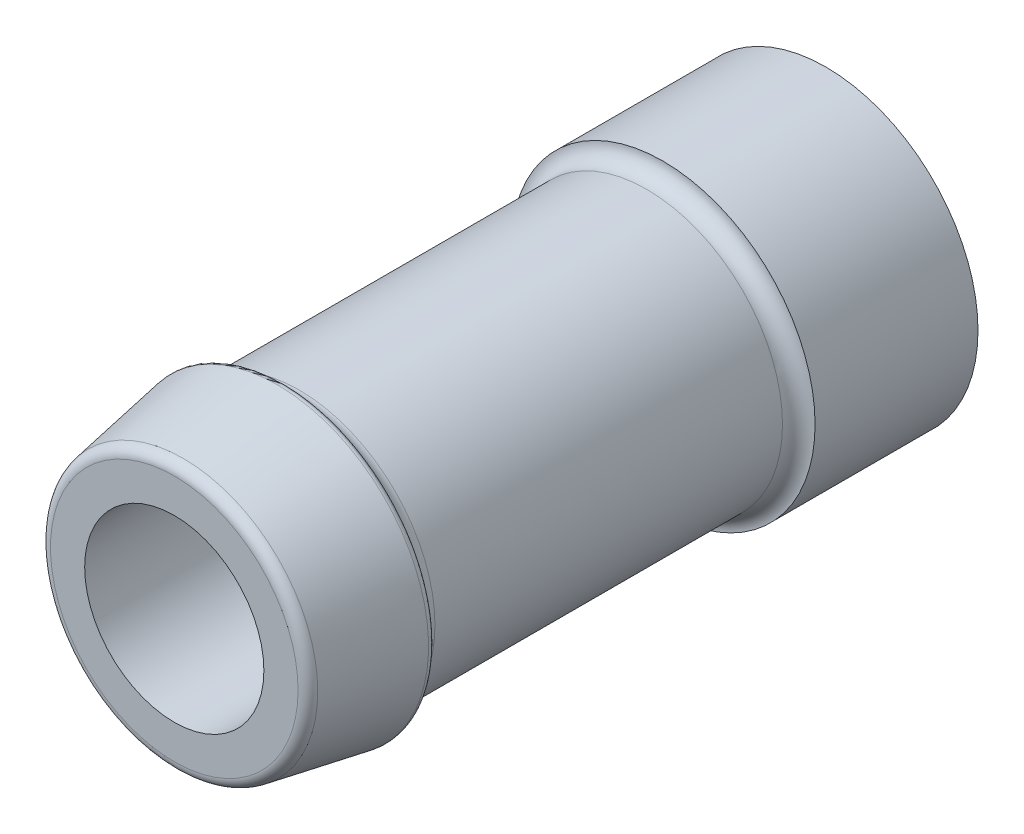
ISO-10303-21;
HEADER;
FILE_DESCRIPTION(('STEP AP214'),'2;1');
FILE_NAME('part.step','',(''),(''),'','','');
FILE_SCHEMA(('AUTOMOTIVE_DESIGN { 1 0 10303 214 1 1 1 1 }'));
ENDSEC;
DATA;
#1=APPLICATION_CONTEXT('core data for automotive mechanical design processes');
#2=APPLICATION_PROTOCOL_DEFINITION('international standard','automotive_design',2000,#1);
#3=PRODUCT_CONTEXT('',#1,'mechanical');
#4=PRODUCT('Part','Part','',(#3));
#5=PRODUCT_RELATED_PRODUCT_CATEGORY('part','',(#4));
#6=PRODUCT_DEFINITION_FORMATION('','',#4);
#7=PRODUCT_DEFINITION_CONTEXT('part definition',#1,'design');
#8=PRODUCT_DEFINITION('design','',#6,#7);
#9=PRODUCT_DEFINITION_SHAPE('','',#8);
#10=(LENGTH_UNIT() NAMED_UNIT(*) SI_UNIT(.MILLI.,.METRE.));
#11=(NAMED_UNIT(*) PLANE_ANGLE_UNIT() SI_UNIT($,.RADIAN.));
#12=(NAMED_UNIT(*) SI_UNIT($,.STERADIAN.) SOLID_ANGLE_UNIT());
#13=UNCERTAINTY_MEASURE_WITH_UNIT(LENGTH_MEASURE(1.E-05),#10,'distance_accuracy_value','');
#14=(GEOMETRIC_REPRESENTATION_CONTEXT(3) GLOBAL_UNCERTAINTY_ASSIGNED_CONTEXT((#13)) GLOBAL_UNIT_ASSIGNED_CONTEXT((#10,
#11,#12)) REPRESENTATION_CONTEXT('',''));
#15=CARTESIAN_POINT('',(0.,0.,0.));
#16=DIRECTION('',(0.,0.,1.));
#17=DIRECTION('',(1.,0.,0.));
#18=AXIS2_PLACEMENT_3D('',#15,#16,#17);
#19=CARTESIAN_POINT('',(0.,0.,30.48));
#20=DIRECTION('',(0.,0.,-1.));
#21=DIRECTION('',(-1.,0.,0.));
#22=AXIS2_PLACEMENT_3D('',#19,#20,#21);
#23=CYLINDRICAL_SURFACE('',#22,7.112);
#24=CARTESIAN_POINT('',(0.,0.,0.));
#25=DIRECTION('',(0.,0.,1.));
#26=DIRECTION('',(1.,0.,0.));
#27=AXIS2_PLACEMENT_3D('',#24,#25,#26);
#28=CIRCLE('',#27,7.112);
#29=CARTESIAN_POINT('',(-7.112,0.,0.));
#30=VERTEX_POINT('',#29);
#31=EDGE_CURVE('E71',#30,#30,#28,.T.);
#32=CARTESIAN_POINT('',(0.,0.,7.62));
#33=DIRECTION('',(0.,0.,1.));
#34=DIRECTION('',(1.,0.,0.));
#35=AXIS2_PLACEMENT_3D('',#32,#33,#34);
#36=CIRCLE('',#35,7.112);
#37=CARTESIAN_POINT('',(-7.112,0.,7.61999999999999));
#38=VERTEX_POINT('',#37);
#39=EDGE_CURVE('E72',#38,#38,#36,.T.);
#40=CARTESIAN_POINT('',(-7.112,0.,0.));
#41=CARTESIAN_POINT('',(-7.112,0.,0.0793749999999997));
#42=CARTESIAN_POINT('',(-7.112,0.,0.158749999999999));
#43=CARTESIAN_POINT('',(-7.112,0.,0.3175));
#44=CARTESIAN_POINT('',(-7.112,0.,0.396875));
#45=CARTESIAN_POINT('',(-7.112,0.,0.555625000000001));
#46=CARTESIAN_POINT('',(-7.112,0.,0.635));
#47=CARTESIAN_POINT('',(-7.112,0.,0.793749999999999));
#48=CARTESIAN_POINT('',(-7.112,0.,0.873124999999999));
#49=CARTESIAN_POINT('',(-7.112,0.,1.031875));
#50=CARTESIAN_POINT('',(-7.112,0.,1.11125));
#51=CARTESIAN_POINT('',(-7.112,0.,1.27));
#52=CARTESIAN_POINT('',(-7.112,0.,1.349375));
#53=CARTESIAN_POINT('',(-7.112,0.,1.508125));
#54=CARTESIAN_POINT('',(-7.112,0.,1.5875));
#55=CARTESIAN_POINT('',(-7.112,0.,1.74625));
#56=CARTESIAN_POINT('',(-7.112,0.,1.825625));
#57=CARTESIAN_POINT('',(-7.112,0.,1.984375));
#58=CARTESIAN_POINT('',(-7.112,0.,2.06375));
#59=CARTESIAN_POINT('',(-7.112,0.,2.2225));
#60=CARTESIAN_POINT('',(-7.112,0.,2.301875));
#61=CARTESIAN_POINT('',(-7.112,0.,2.460625));
#62=CARTESIAN_POINT('',(-7.112,0.,2.54));
#63=CARTESIAN_POINT('',(-7.112,0.,2.69875));
#64=CARTESIAN_POINT('',(-7.112,0.,2.778125));
#65=CARTESIAN_POINT('',(-7.112,0.,2.936875));
#66=CARTESIAN_POINT('',(-7.112,0.,3.01625));
#67=CARTESIAN_POINT('',(-7.112,0.,3.175));
#68=CARTESIAN_POINT('',(-7.112,0.,3.254375));
#69=CARTESIAN_POINT('',(-7.112,0.,3.413125));
#70=CARTESIAN_POINT('',(-7.112,0.,3.4925));
#71=CARTESIAN_POINT('',(-7.112,0.,3.65125));
#72=CARTESIAN_POINT('',(-7.112,0.,3.730625));
#73=CARTESIAN_POINT('',(-7.112,0.,3.889375));
#74=CARTESIAN_POINT('',(-7.112,0.,3.96875));
#75=CARTESIAN_POINT('',(-7.112,0.,4.1275));
#76=CARTESIAN_POINT('',(-7.112,0.,4.206875));
#77=CARTESIAN_POINT('',(-7.112,0.,4.365625));
#78=CARTESIAN_POINT('',(-7.112,0.,4.445));
#79=CARTESIAN_POINT('',(-7.112,0.,4.60375));
#80=CARTESIAN_POINT('',(-7.112,0.,4.683125));
#81=CARTESIAN_POINT('',(-7.112,0.,4.841875));
#82=CARTESIAN_POINT('',(-7.112,0.,4.92125));
#83=CARTESIAN_POINT('',(-7.112,0.,5.07999999999999));
#84=CARTESIAN_POINT('',(-7.112,0.,5.159375));
#85=CARTESIAN_POINT('',(-7.112,0.,5.318125));
#86=CARTESIAN_POINT('',(-7.112,0.,5.3975));
#87=CARTESIAN_POINT('',(-7.112,0.,5.55625));
#88=CARTESIAN_POINT('',(-7.112,0.,5.635625));
#89=CARTESIAN_POINT('',(-7.112,0.,5.794375));
#90=CARTESIAN_POINT('',(-7.112,0.,5.87375));
#91=CARTESIAN_POINT('',(-7.112,0.,6.0325));
#92=CARTESIAN_POINT('',(-7.112,0.,6.111875));
#93=CARTESIAN_POINT('',(-7.112,0.,6.27062499999999));
#94=CARTESIAN_POINT('',(-7.112,0.,6.34999999999999));
#95=CARTESIAN_POINT('',(-7.112,0.,6.50874999999999));
#96=CARTESIAN_POINT('',(-7.112,0.,6.588125));
#97=CARTESIAN_POINT('',(-7.112,0.,6.746875));
#98=CARTESIAN_POINT('',(-7.112,0.,6.82625));
#99=CARTESIAN_POINT('',(-7.112,0.,6.985));
#100=CARTESIAN_POINT('',(-7.112,0.,7.064375));
#101=CARTESIAN_POINT('',(-7.112,0.,7.223125));
#102=CARTESIAN_POINT('',(-7.112,0.,7.3025));
#103=CARTESIAN_POINT('',(-7.112,0.,7.46125));
#104=CARTESIAN_POINT('',(-7.112,0.,7.540625));
#105=CARTESIAN_POINT('',(-7.112,0.,7.61999999999999));
#106=B_SPLINE_CURVE_WITH_KNOTS('',3,(#40,#41,#42,#43,#44,#45,#46,#47,#48,#49,#50,#51,#52,#53,
#54,#55,#56,#57,#58,#59,#60,#61,#62,#63,#64,#65,#66,#67,#68,#69,#70,#71,#72,#73,#74,#75,#76,#77,
#78,#79,#80,#81,#82,#83,#84,#85,#86,#87,#88,#89,#90,#91,#92,#93,#94,#95,#96,#97,#98,#99,#100,
#101,#102,#103,#104,#105),.UNSPECIFIED.,.F.,.F.,(4,2,2,2,2,2,2,2,2,2,2,2,2,2,2,2,2,2,2,2,2,2,2,
2,2,2,2,2,2,2,2,2,4),(0.,0.238124999999999,0.476250000000001,0.714375,0.952499999999998,
1.190625,1.42875,1.666875,1.905,2.143125,2.38125,2.619375,2.8575,3.095625,3.33375,3.571875,3.81,
4.048125,4.28625,4.524375,4.7625,5.00062499999999,5.23875,5.476875,5.715,5.953125,6.19125,
6.42937499999999,6.6675,6.905625,7.14375,7.381875,7.61999999999999),.UNSPECIFIED.);
#107=EDGE_CURVE('BSEAM39',#30,#38,#106,.T.);
#108=ORIENTED_EDGE('',*,*,#31,.T.);
#109=ORIENTED_EDGE('',*,*,#39,.F.);
#110=ORIENTED_EDGE('',*,*,#107,.T.);
#111=ORIENTED_EDGE('',*,*,#107,.F.);
#112=EDGE_LOOP('',(#108,#110,#109,#111));
#113=FACE_BOUND('',#112,.T.);
#114=ADVANCED_FACE('F39',(#113),#23,.T.);
#115=CARTESIAN_POINT('',(0.,0.,30.48));
#116=DIRECTION('',(0.,0.,1.));
#117=DIRECTION('',(1.,0.,0.));
#118=AXIS2_PLACEMENT_3D('',#115,#116,#117);
#119=PLANE('',#118);
#120=CARTESIAN_POINT('',(0.,0.,30.48));
#121=DIRECTION('',(0.,0.,1.));
#122=DIRECTION('',(1.,0.,0.));
#123=AXIS2_PLACEMENT_3D('',#120,#121,#122);
#124=CIRCLE('',#123,5.78999632536298);
#125=CARTESIAN_POINT('',(5.78999632536298,0.,30.48));
#126=VERTEX_POINT('',#125);
#127=EDGE_CURVE('E57',#126,#126,#124,.T.);
#128=ORIENTED_EDGE('',*,*,#127,.T.);
#129=EDGE_LOOP('',(#128));
#130=FACE_BOUND('',#129,.T.);
#131=CARTESIAN_POINT('',(0.,0.,30.48));
#132=DIRECTION('',(0.,0.,1.));
#133=DIRECTION('',(1.,0.,0.));
#134=AXIS2_PLACEMENT_3D('',#131,#132,#133);
#135=CIRCLE('',#134,4.191);
#136=CARTESIAN_POINT('',(4.191,0.,30.48));
#137=VERTEX_POINT('',#136);
#138=EDGE_CURVE('E76',#137,#137,#135,.T.);
#139=ORIENTED_EDGE('',*,*,#138,.F.);
#140=EDGE_LOOP('',(#139));
#141=FACE_BOUND('',#140,.T.);
#142=ADVANCED_FACE('F98',(#130,#141),#119,.T.);
#143=CARTESIAN_POINT('',(0.,0.,0.));
#144=DIRECTION('',(0.,0.,1.));
#145=DIRECTION('',(1.,0.,0.));
#146=AXIS2_PLACEMENT_3D('',#143,#144,#145);
#147=PLANE('',#146);
#148=CARTESIAN_POINT('',(0.,0.,0.));
#149=DIRECTION('',(0.,0.,1.));
#150=DIRECTION('',(1.,0.,0.));
#151=AXIS2_PLACEMENT_3D('',#148,#149,#150);
#152=CIRCLE('',#151,4.191);
#153=CARTESIAN_POINT('',(4.191,0.,0.));
#154=VERTEX_POINT('',#153);
#155=EDGE_CURVE('E80',#154,#154,#152,.T.);
#156=ORIENTED_EDGE('',*,*,#155,.T.);
#157=EDGE_LOOP('',(#156));
#158=FACE_BOUND('',#157,.T.);
#159=ORIENTED_EDGE('',*,*,#31,.F.);
#160=EDGE_LOOP('',(#159));
#161=FACE_BOUND('',#160,.T.);
#162=ADVANCED_FACE('F88',(#158,#161),#147,.F.);
#163=CARTESIAN_POINT('',(0.,0.,0.));
#164=DIRECTION('',(0.,0.,1.));
#165=DIRECTION('',(1.,0.,0.));
#166=AXIS2_PLACEMENT_3D('',#163,#164,#165);
#167=CYLINDRICAL_SURFACE('',#166,4.191);
#168=CARTESIAN_POINT('',(4.191,0.,0.));
#169=CARTESIAN_POINT('',(4.191,0.,0.317499999999999));
#170=CARTESIAN_POINT('',(4.191,0.,0.635));
#171=CARTESIAN_POINT('',(4.191,0.,1.27));
#172=CARTESIAN_POINT('',(4.191,0.,1.5875));
#173=CARTESIAN_POINT('',(4.191,0.,2.2225));
#174=CARTESIAN_POINT('',(4.191,0.,2.54));
#175=CARTESIAN_POINT('',(4.191,0.,3.175));
#176=CARTESIAN_POINT('',(4.191,0.,3.4925));
#177=CARTESIAN_POINT('',(4.191,0.,4.1275));
#178=CARTESIAN_POINT('',(4.191,0.,4.445));
#179=CARTESIAN_POINT('',(4.191,0.,5.08));
#180=CARTESIAN_POINT('',(4.191,0.,5.3975));
#181=CARTESIAN_POINT('',(4.191,0.,6.0325));
#182=CARTESIAN_POINT('',(4.191,0.,6.35));
#183=CARTESIAN_POINT('',(4.191,0.,6.985));
#184=CARTESIAN_POINT('',(4.191,0.,7.3025));
#185=CARTESIAN_POINT('',(4.191,0.,7.9375));
#186=CARTESIAN_POINT('',(4.191,0.,8.255));
#187=CARTESIAN_POINT('',(4.191,0.,8.89));
#188=CARTESIAN_POINT('',(4.191,0.,9.2075));
#189=CARTESIAN_POINT('',(4.191,0.,9.8425));
#190=CARTESIAN_POINT('',(4.191,0.,10.16));
#191=CARTESIAN_POINT('',(4.191,0.,10.795));
#192=CARTESIAN_POINT('',(4.191,0.,11.1125));
#193=CARTESIAN_POINT('',(4.191,0.,11.7475));
#194=CARTESIAN_POINT('',(4.191,0.,12.065));
#195=CARTESIAN_POINT('',(4.191,0.,12.7));
#196=CARTESIAN_POINT('',(4.191,0.,13.0175));
#197=CARTESIAN_POINT('',(4.191,0.,13.6525));
#198=CARTESIAN_POINT('',(4.191,0.,13.97));
#199=CARTESIAN_POINT('',(4.191,0.,14.605));
#200=CARTESIAN_POINT('',(4.191,0.,14.9225));
#201=CARTESIAN_POINT('',(4.191,0.,15.5575));
#202=CARTESIAN_POINT('',(4.191,0.,15.875));
#203=CARTESIAN_POINT('',(4.191,0.,16.51));
#204=CARTESIAN_POINT('',(4.191,0.,16.8275));
#205=CARTESIAN_POINT('',(4.191,0.,17.4625));
#206=CARTESIAN_POINT('',(4.191,0.,17.78));
#207=CARTESIAN_POINT('',(4.191,0.,18.415));
#208=CARTESIAN_POINT('',(4.191,0.,18.7325));
#209=CARTESIAN_POINT('',(4.191,0.,19.3675));
#210=CARTESIAN_POINT('',(4.191,0.,19.685));
#211=CARTESIAN_POINT('',(4.191,0.,20.32));
#212=CARTESIAN_POINT('',(4.191,0.,20.6375));
#213=CARTESIAN_POINT('',(4.191,0.,21.2725));
#214=CARTESIAN_POINT('',(4.191,0.,21.59));
#215=CARTESIAN_POINT('',(4.191,0.,22.225));
#216=CARTESIAN_POINT('',(4.191,0.,22.5425));
#217=CARTESIAN_POINT('',(4.191,0.,23.1775));
#218=CARTESIAN_POINT('',(4.191,0.,23.495));
#219=CARTESIAN_POINT('',(4.191,0.,24.13));
#220=CARTESIAN_POINT('',(4.191,0.,24.4475));
#221=CARTESIAN_POINT('',(4.191,0.,25.0825));
#222=CARTESIAN_POINT('',(4.191,0.,25.4));
#223=CARTESIAN_POINT('',(4.191,0.,26.035));
#224=CARTESIAN_POINT('',(4.191,0.,26.3525));
#225=CARTESIAN_POINT('',(4.191,0.,26.9875));
#226=CARTESIAN_POINT('',(4.191,0.,27.305));
#227=CARTESIAN_POINT('',(4.191,0.,27.94));
#228=CARTESIAN_POINT('',(4.191,0.,28.2575));
#229=CARTESIAN_POINT('',(4.191,0.,28.8925));
#230=CARTESIAN_POINT('',(4.191,0.,29.21));
#231=CARTESIAN_POINT('',(4.191,0.,29.845));
#232=CARTESIAN_POINT('',(4.191,0.,30.1625));
#233=CARTESIAN_POINT('',(4.191,0.,30.48));
#234=B_SPLINE_CURVE_WITH_KNOTS('',3,(#168,#169,#170,#171,#172,#173,#174,#175,#176,#177,#178,
#179,#180,#181,#182,#183,#184,#185,#186,#187,#188,#189,#190,#191,#192,#193,#194,#195,#196,#197,
#198,#199,#200,#201,#202,#203,#204,#205,#206,#207,#208,#209,#210,#211,#212,#213,#214,#215,#216,
#217,#218,#219,#220,#221,#222,#223,#224,#225,#226,#227,#228,#229,#230,#231,#232,#233),
.UNSPECIFIED.,.F.,.F.,(4,2,2,2,2,2,2,2,2,2,2,2,2,2,2,2,2,2,2,2,2,2,2,2,2,2,2,2,2,2,2,2,4),(0.,
0.9525,1.905,2.8575,3.81,4.7625,5.715,6.6675,7.62,8.5725,9.525,10.4775,11.43,12.3825,13.335,
14.2875,15.24,16.1925,17.145,18.0975,19.05,20.0025,20.955,21.9075,22.86,23.8125,24.765,25.7175,
26.67,27.6225,28.575,29.5275,30.48),.UNSPECIFIED.);
#235=EDGE_CURVE('BSEAM91',#154,#137,#234,.T.);
#236=ORIENTED_EDGE('',*,*,#155,.F.);
#237=ORIENTED_EDGE('',*,*,#138,.T.);
#238=ORIENTED_EDGE('',*,*,#235,.T.);
#239=ORIENTED_EDGE('',*,*,#235,.F.);
#240=EDGE_LOOP('',(#236,#238,#237,#239));
#241=FACE_BOUND('',#240,.T.);
#242=ADVANCED_FACE('F91',(#241),#167,.F.);
#243=CARTESIAN_POINT('',(0.,0.,7.62));
#244=DIRECTION('',(0.,0.,1.));
#245=DIRECTION('',(1.,0.,0.));
#246=AXIS2_PLACEMENT_3D('',#243,#244,#245);
#247=CYLINDRICAL_SURFACE('',#246,6.35);
#248=CARTESIAN_POINT('',(0.,0.,24.638));
#249=DIRECTION('',(0.,0.,1.));
#250=DIRECTION('',(1.,0.,0.));
#251=AXIS2_PLACEMENT_3D('',#248,#249,#250);
#252=CIRCLE('',#251,6.35);
#253=CARTESIAN_POINT('',(6.35,0.,24.638));
#254=VERTEX_POINT('',#253);
#255=EDGE_CURVE('E63',#254,#254,#252,.F.);
#256=ORIENTED_EDGE('',*,*,#255,.T.);
#257=EDGE_LOOP('',(#256));
#258=FACE_BOUND('',#257,.T.);
#259=CARTESIAN_POINT('',(0.,0.,8.382));
#260=DIRECTION('',(0.,0.,1.));
#261=DIRECTION('',(1.,0.,0.));
#262=AXIS2_PLACEMENT_3D('',#259,#260,#261);
#263=CIRCLE('',#262,6.35);
#264=CARTESIAN_POINT('',(6.35,0.,8.382));
#265=VERTEX_POINT('',#264);
#266=EDGE_CURVE('E67',#265,#265,#263,.T.);
#267=ORIENTED_EDGE('',*,*,#266,.T.);
#268=EDGE_LOOP('',(#267));
#269=FACE_BOUND('',#268,.T.);
#270=ADVANCED_FACE('F94',(#258,#269),#247,.T.);
#271=CARTESIAN_POINT('',(0.,0.,8.382));
#272=DIRECTION('',(0.,0.,1.));
#273=DIRECTION('',(1.,0.,0.));
#274=AXIS2_PLACEMENT_3D('',#271,#272,#273);
#275=TOROIDAL_SURFACE('',#274,7.112,0.762);
#276=ORIENTED_EDGE('',*,*,#39,.T.);
#277=EDGE_LOOP('',(#276));
#278=FACE_BOUND('',#277,.T.);
#279=ORIENTED_EDGE('',*,*,#266,.F.);
#280=EDGE_LOOP('',(#279));
#281=FACE_BOUND('',#280,.T.);
#282=ADVANCED_FACE('F111',(#278,#281),#275,.F.);
#283=CARTESIAN_POINT('',(0.,0.,24.638));
#284=DIRECTION('',(0.,0.,1.));
#285=DIRECTION('',(1.,0.,0.));
#286=AXIS2_PLACEMENT_3D('',#283,#284,#285);
#287=TOROIDAL_SURFACE('',#286,7.112,0.762);
#288=CARTESIAN_POINT('',(0.,0.,25.3671751193928));
#289=DIRECTION('',(0.,0.,-1.));
#290=DIRECTION('',(-1.,0.,0.));
#291=AXIS2_PLACEMENT_3D('',#288,#289,#290);
#292=CIRCLE('',#291,6.89075885270041);
#293=CARTESIAN_POINT('',(-6.89075885270041,0.,25.3671751193928));
#294=VERTEX_POINT('',#293);
#295=EDGE_CURVE('E10',#294,#294,#292,.T.);
#296=ORIENTED_EDGE('',*,*,#295,.T.);
#297=EDGE_LOOP('',(#296));
#298=FACE_BOUND('',#297,.T.);
#299=ORIENTED_EDGE('',*,*,#255,.F.);
#300=EDGE_LOOP('',(#299));
#301=FACE_BOUND('',#300,.T.);
#302=ADVANCED_FACE('F114',(#298,#301),#287,.F.);
#303=CARTESIAN_POINT('',(0.,0.,30.48));
#304=DIRECTION('',(0.,0.,-1.));
#305=DIRECTION('',(-1.,0.,0.));
#306=AXIS2_PLACEMENT_3D('',#303,#304,#305);
#307=CONICAL_SURFACE('',#306,6.21625893800104,0.17453292519943);
#308=CARTESIAN_POINT('',(0.,0.,25.6543401296512));
#309=DIRECTION('',(0.,0.,-1.));
#310=DIRECTION('',(-1.,0.,0.));
#311=AXIS2_PLACEMENT_3D('',#308,#309,#310);
#312=CIRCLE('',#311,7.06715297286563);
#313=CARTESIAN_POINT('',(-7.06715297286563,0.,25.6543401296512));
#314=VERTEX_POINT('',#313);
#315=EDGE_CURVE('E47',#314,#314,#312,.F.);
#316=ORIENTED_EDGE('',*,*,#315,.T.);
#317=EDGE_LOOP('',(#316));
#318=FACE_BOUND('',#317,.T.);
#319=CARTESIAN_POINT('',(0.,0.,30.0602132742548));
#320=DIRECTION('',(0.,0.,1.));
#321=DIRECTION('',(1.,0.,0.));
#322=AXIS2_PLACEMENT_3D('',#319,#320,#321);
#323=CIRCLE('',#322,6.29027866389318);
#324=CARTESIAN_POINT('',(6.29027866389318,0.,30.0602132742548));
#325=VERTEX_POINT('',#324);
#326=EDGE_CURVE('E52',#325,#325,#323,.F.);
#327=ORIENTED_EDGE('',*,*,#326,.T.);
#328=EDGE_LOOP('',(#327));
#329=FACE_BOUND('',#328,.T.);
#330=ADVANCED_FACE('F118',(#318,#329),#307,.T.);
#331=CARTESIAN_POINT('',(0.,0.,29.972));
#332=DIRECTION('',(0.,0.,1.));
#333=DIRECTION('',(1.,0.,0.));
#334=AXIS2_PLACEMENT_3D('',#331,#332,#333);
#335=TOROIDAL_SURFACE('',#334,5.78999632536298,0.508);
#336=ORIENTED_EDGE('',*,*,#326,.F.);
#337=EDGE_LOOP('',(#336));
#338=FACE_BOUND('',#337,.T.);
#339=ORIENTED_EDGE('',*,*,#127,.F.);
#340=EDGE_LOOP('',(#339));
#341=FACE_BOUND('',#340,.T.);
#342=ADVANCED_FACE('F123',(#338,#341),#335,.T.);
#343=CARTESIAN_POINT('',(0.,0.,25.6102334925238));
#344=DIRECTION('',(0.,0.,-1.));
#345=DIRECTION('',(-1.,0.,0.));
#346=AXIS2_PLACEMENT_3D('',#343,#344,#345);
#347=TOROIDAL_SURFACE('',#346,6.81701180360053,0.254);
#348=ORIENTED_EDGE('',*,*,#295,.F.);
#349=EDGE_LOOP('',(#348));
#350=FACE_BOUND('',#349,.T.);
#351=ORIENTED_EDGE('',*,*,#315,.F.);
#352=EDGE_LOOP('',(#351));
#353=FACE_BOUND('',#352,.T.);
#354=ADVANCED_FACE('F41',(#350,#353),#347,.T.);
#355=CLOSED_SHELL('',(#114,#142,#162,#242,#270,#282,#302,#330,#342,#354));
#356=MANIFOLD_SOLID_BREP('B2',#355);
#357=ADVANCED_BREP_SHAPE_REPRESENTATION('',(#18,#356),#14);
#358=SHAPE_DEFINITION_REPRESENTATION(#9,#357);
ENDSEC;
END-ISO-10303-21;
